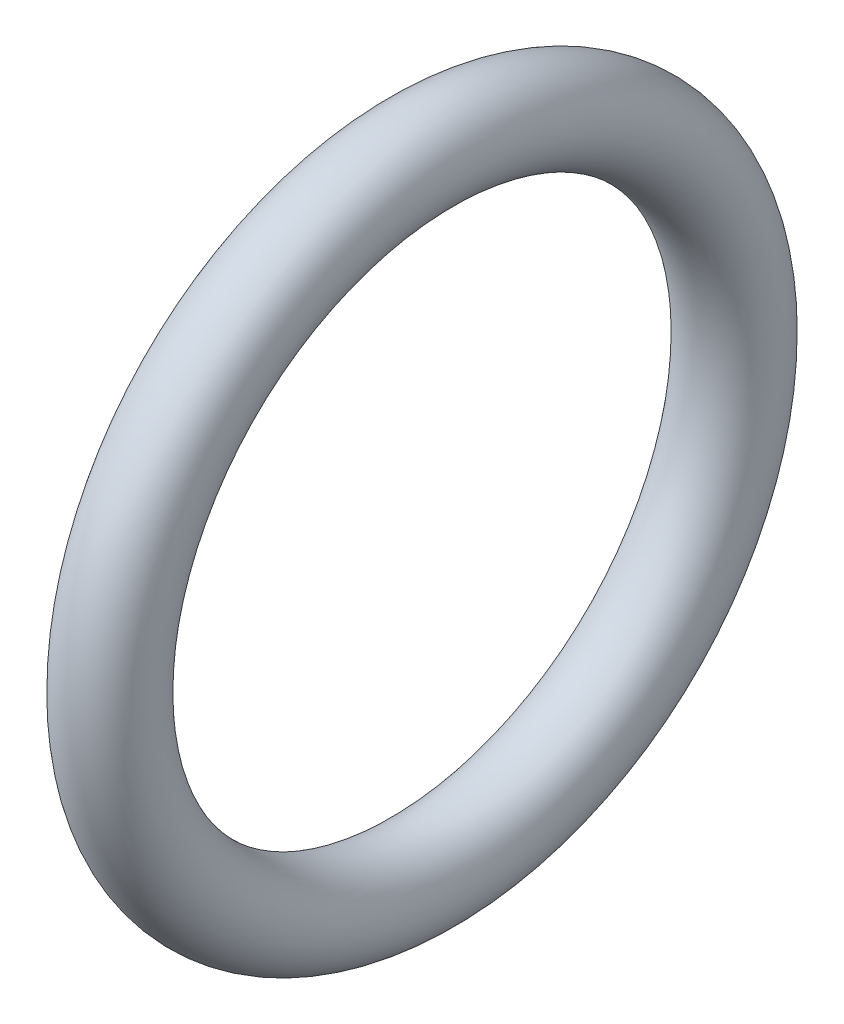
ISO-10303-21;
HEADER;
FILE_DESCRIPTION(('STEP AP214'),'2;1');
FILE_NAME('part.step','',(''),(''),'','','');
FILE_SCHEMA(('AUTOMOTIVE_DESIGN { 1 0 10303 214 1 1 1 1 }'));
ENDSEC;
DATA;
#1=APPLICATION_CONTEXT('core data for automotive mechanical design processes');
#2=APPLICATION_PROTOCOL_DEFINITION('international standard','automotive_design',2000,#1);
#3=PRODUCT_CONTEXT('',#1,'mechanical');
#4=PRODUCT('Part','Part','',(#3));
#5=PRODUCT_RELATED_PRODUCT_CATEGORY('part','',(#4));
#6=PRODUCT_DEFINITION_FORMATION('','',#4);
#7=PRODUCT_DEFINITION_CONTEXT('part definition',#1,'design');
#8=PRODUCT_DEFINITION('design','',#6,#7);
#9=PRODUCT_DEFINITION_SHAPE('','',#8);
#10=(LENGTH_UNIT() NAMED_UNIT(*) SI_UNIT(.MILLI.,.METRE.));
#11=(NAMED_UNIT(*) PLANE_ANGLE_UNIT() SI_UNIT($,.RADIAN.));
#12=(NAMED_UNIT(*) SI_UNIT($,.STERADIAN.) SOLID_ANGLE_UNIT());
#13=UNCERTAINTY_MEASURE_WITH_UNIT(LENGTH_MEASURE(1.E-05),#10,'distance_accuracy_value','');
#14=(GEOMETRIC_REPRESENTATION_CONTEXT(3) GLOBAL_UNCERTAINTY_ASSIGNED_CONTEXT((#13)) GLOBAL_UNIT_ASSIGNED_CONTEXT((#10,
#11,#12)) REPRESENTATION_CONTEXT('',''));
#15=CARTESIAN_POINT('',(0.,0.,0.));
#16=DIRECTION('',(0.,0.,1.));
#17=DIRECTION('',(1.,0.,0.));
#18=AXIS2_PLACEMENT_3D('',#15,#16,#17);
#19=CARTESIAN_POINT('',(0.,0.,0.));
#20=DIRECTION('',(-1.,0.,0.));
#21=DIRECTION('',(0.,0.,1.));
#22=AXIS2_PLACEMENT_3D('',#19,#20,#21);
#23=TOROIDAL_SURFACE('',#22,222.25,31.75);
#24=CARTESIAN_POINT('',(0.,0.,254.));
#25=VERTEX_POINT('',#24);
#26=VERTEX_LOOP('',#25);
#27=FACE_BOUND('',#26,.T.);
#28=ADVANCED_FACE('F33',(#27),#23,.T.);
#29=CLOSED_SHELL('',(#28));
#30=MANIFOLD_SOLID_BREP('B2',#29);
#31=ADVANCED_BREP_SHAPE_REPRESENTATION('',(#18,#30),#14);
#32=SHAPE_DEFINITION_REPRESENTATION(#9,#31);
ENDSEC;
END-ISO-10303-21;
